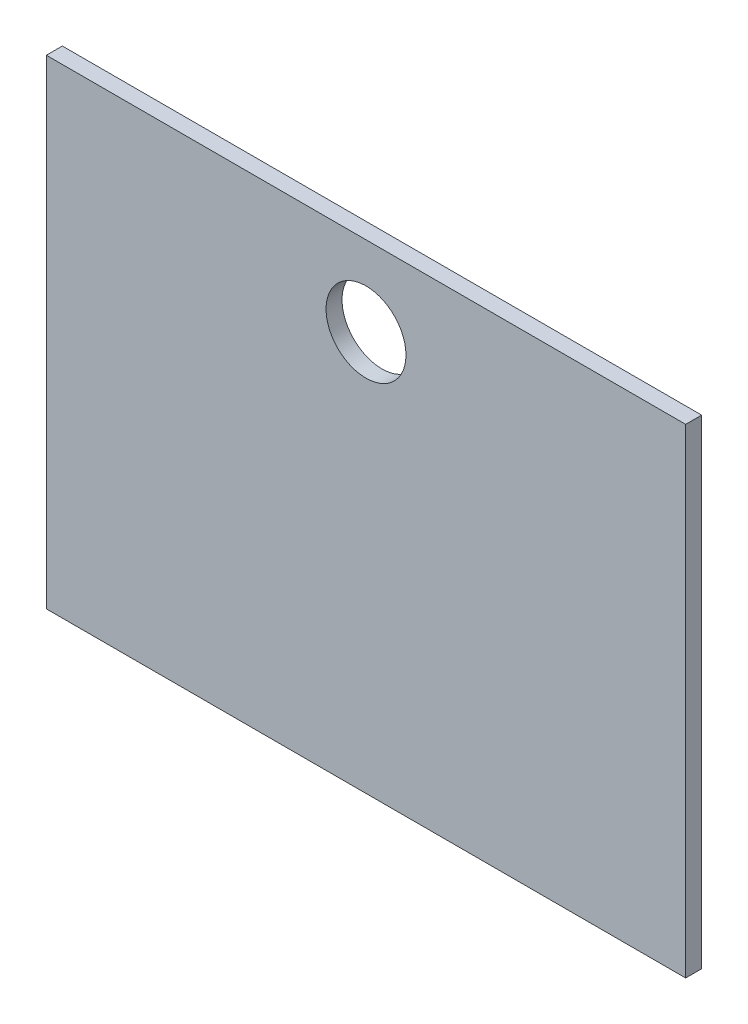
ISO-10303-21;
HEADER;
FILE_DESCRIPTION(('STEP AP214'),'2;1');
FILE_NAME('part.step','',(''),(''),'','','');
FILE_SCHEMA(('AUTOMOTIVE_DESIGN { 1 0 10303 214 1 1 1 1 }'));
ENDSEC;
DATA;
#1=APPLICATION_CONTEXT('core data for automotive mechanical design processes');
#2=APPLICATION_PROTOCOL_DEFINITION('international standard','automotive_design',2000,#1);
#3=PRODUCT_CONTEXT('',#1,'mechanical');
#4=PRODUCT('Part','Part','',(#3));
#5=PRODUCT_RELATED_PRODUCT_CATEGORY('part','',(#4));
#6=PRODUCT_DEFINITION_FORMATION('','',#4);
#7=PRODUCT_DEFINITION_CONTEXT('part definition',#1,'design');
#8=PRODUCT_DEFINITION('design','',#6,#7);
#9=PRODUCT_DEFINITION_SHAPE('','',#8);
#10=(LENGTH_UNIT() NAMED_UNIT(*) SI_UNIT(.MILLI.,.METRE.));
#11=(NAMED_UNIT(*) PLANE_ANGLE_UNIT() SI_UNIT($,.RADIAN.));
#12=(NAMED_UNIT(*) SI_UNIT($,.STERADIAN.) SOLID_ANGLE_UNIT());
#13=UNCERTAINTY_MEASURE_WITH_UNIT(LENGTH_MEASURE(1.E-05),#10,'distance_accuracy_value','');
#14=(GEOMETRIC_REPRESENTATION_CONTEXT(3) GLOBAL_UNCERTAINTY_ASSIGNED_CONTEXT((#13)) GLOBAL_UNIT_ASSIGNED_CONTEXT((#10,
#11,#12)) REPRESENTATION_CONTEXT('',''));
#15=CARTESIAN_POINT('',(0.,0.,0.));
#16=DIRECTION('',(0.,0.,1.));
#17=DIRECTION('',(1.,0.,0.));
#18=AXIS2_PLACEMENT_3D('',#15,#16,#17);
#19=CARTESIAN_POINT('',(-40.,9.99999999999999,2.));
#20=DIRECTION('',(1.,0.,0.));
#21=DIRECTION('',(0.,1.,0.));
#22=AXIS2_PLACEMENT_3D('',#19,#20,#21);
#23=PLANE('',#22);
#24=DIRECTION('',(0.,-1.,0.));
#25=VECTOR('',#24,1.);
#26=CARTESIAN_POINT('',(-40.,9.99999999999999,0.));
#27=LINE('',#26,#25);
#28=CARTESIAN_POINT('',(-40.,9.99999999999999,0.));
#29=VERTEX_POINT('',#28);
#30=CARTESIAN_POINT('',(-40.,-50.,0.));
#31=VERTEX_POINT('',#30);
#32=EDGE_CURVE('E86',#29,#31,#27,.T.);
#33=ORIENTED_EDGE('',*,*,#32,.T.);
#34=DIRECTION('',(0.,0.,-1.));
#35=VECTOR('',#34,1.);
#36=CARTESIAN_POINT('',(-40.,-50.,2.));
#37=LINE('',#36,#35);
#38=CARTESIAN_POINT('',(-40.,-50.,2.));
#39=VERTEX_POINT('',#38);
#40=EDGE_CURVE('E89',#39,#31,#37,.T.);
#41=ORIENTED_EDGE('',*,*,#40,.F.);
#42=DIRECTION('',(0.,-1.,0.));
#43=VECTOR('',#42,1.);
#44=CARTESIAN_POINT('',(-40.,9.99999999999999,2.));
#45=LINE('',#44,#43);
#46=CARTESIAN_POINT('',(-40.,9.99999999999999,2.));
#47=VERTEX_POINT('',#46);
#48=EDGE_CURVE('E73',#47,#39,#45,.T.);
#49=ORIENTED_EDGE('',*,*,#48,.F.);
#50=DIRECTION('',(0.,0.,-1.));
#51=VECTOR('',#50,1.);
#52=CARTESIAN_POINT('',(-40.,9.99999999999999,2.));
#53=LINE('',#52,#51);
#54=EDGE_CURVE('E49',#47,#29,#53,.T.);
#55=ORIENTED_EDGE('',*,*,#54,.T.);
#56=EDGE_LOOP('',(#33,#41,#49,#55));
#57=FACE_BOUND('',#56,.T.);
#58=ADVANCED_FACE('F41',(#57),#23,.F.);
#59=CARTESIAN_POINT('',(40.,10.,2.));
#60=DIRECTION('',(-1.,0.,0.));
#61=DIRECTION('',(0.,-1.,0.));
#62=AXIS2_PLACEMENT_3D('',#59,#60,#61);
#63=PLANE('',#62);
#64=DIRECTION('',(0.,1.,0.));
#65=VECTOR('',#64,1.);
#66=CARTESIAN_POINT('',(40.,10.,0.));
#67=LINE('',#66,#65);
#68=CARTESIAN_POINT('',(40.,-50.,0.));
#69=VERTEX_POINT('',#68);
#70=CARTESIAN_POINT('',(40.,10.,0.));
#71=VERTEX_POINT('',#70);
#72=EDGE_CURVE('E68',#69,#71,#67,.T.);
#73=ORIENTED_EDGE('',*,*,#72,.T.);
#74=DIRECTION('',(0.,0.,-1.));
#75=VECTOR('',#74,1.);
#76=CARTESIAN_POINT('',(40.,10.,2.));
#77=LINE('',#76,#75);
#78=CARTESIAN_POINT('',(40.,10.,2.));
#79=VERTEX_POINT('',#78);
#80=EDGE_CURVE('E11',#79,#71,#77,.T.);
#81=ORIENTED_EDGE('',*,*,#80,.F.);
#82=DIRECTION('',(0.,1.,0.));
#83=VECTOR('',#82,1.);
#84=CARTESIAN_POINT('',(40.,10.,2.));
#85=LINE('',#84,#83);
#86=CARTESIAN_POINT('',(40.,-50.,2.));
#87=VERTEX_POINT('',#86);
#88=EDGE_CURVE('E113',#87,#79,#85,.T.);
#89=ORIENTED_EDGE('',*,*,#88,.F.);
#90=DIRECTION('',(0.,0.,1.));
#91=VECTOR('',#90,1.);
#92=CARTESIAN_POINT('',(40.,-50.,2.));
#93=LINE('',#92,#91);
#94=EDGE_CURVE('E99',#69,#87,#93,.T.);
#95=ORIENTED_EDGE('',*,*,#94,.F.);
#96=EDGE_LOOP('',(#73,#81,#89,#95));
#97=FACE_BOUND('',#96,.T.);
#98=ADVANCED_FACE('F120',(#97),#63,.F.);
#99=CARTESIAN_POINT('',(40.,10.,2.));
#100=DIRECTION('',(0.,-1.,0.));
#101=DIRECTION('',(1.,0.,0.));
#102=AXIS2_PLACEMENT_3D('',#99,#100,#101);
#103=PLANE('',#102);
#104=DIRECTION('',(-1.,0.,0.));
#105=VECTOR('',#104,1.);
#106=CARTESIAN_POINT('',(40.,10.,0.));
#107=LINE('',#106,#105);
#108=EDGE_CURVE('E114',#71,#29,#107,.T.);
#109=ORIENTED_EDGE('',*,*,#108,.T.);
#110=ORIENTED_EDGE('',*,*,#54,.F.);
#111=DIRECTION('',(-1.,0.,0.));
#112=VECTOR('',#111,1.);
#113=CARTESIAN_POINT('',(40.,10.,2.));
#114=LINE('',#113,#112);
#115=EDGE_CURVE('E57',#79,#47,#114,.T.);
#116=ORIENTED_EDGE('',*,*,#115,.F.);
#117=ORIENTED_EDGE('',*,*,#80,.T.);
#118=EDGE_LOOP('',(#109,#110,#116,#117));
#119=FACE_BOUND('',#118,.T.);
#120=ADVANCED_FACE('F119',(#119),#103,.F.);
#121=CARTESIAN_POINT('',(0.,0.,2.));
#122=DIRECTION('',(0.,0.,-1.));
#123=DIRECTION('',(-1.,0.,0.));
#124=AXIS2_PLACEMENT_3D('',#121,#122,#123);
#125=PLANE('',#124);
#126=CARTESIAN_POINT('',(0.,0.,2.));
#127=DIRECTION('',(0.,0.,1.));
#128=DIRECTION('',(1.,0.,0.));
#129=AXIS2_PLACEMENT_3D('',#126,#127,#128);
#130=CIRCLE('',#129,5.);
#131=CARTESIAN_POINT('',(5.,0.,2.));
#132=VERTEX_POINT('',#131);
#133=EDGE_CURVE('E107',#132,#132,#130,.T.);
#134=ORIENTED_EDGE('',*,*,#133,.F.);
#135=EDGE_LOOP('',(#134));
#136=FACE_BOUND('',#135,.T.);
#137=ORIENTED_EDGE('',*,*,#48,.T.);
#138=DIRECTION('',(-1.,0.,0.));
#139=VECTOR('',#138,1.);
#140=CARTESIAN_POINT('',(-40.,-50.,2.));
#141=LINE('',#140,#139);
#142=EDGE_CURVE('E102',#87,#39,#141,.T.);
#143=ORIENTED_EDGE('',*,*,#142,.F.);
#144=ORIENTED_EDGE('',*,*,#88,.T.);
#145=ORIENTED_EDGE('',*,*,#115,.T.);
#146=EDGE_LOOP('',(#137,#143,#144,#145));
#147=FACE_BOUND('',#146,.T.);
#148=ADVANCED_FACE('F121',(#136,#147),#125,.F.);
#149=CARTESIAN_POINT('',(0.,0.,0.));
#150=DIRECTION('',(0.,0.,-1.));
#151=DIRECTION('',(-1.,0.,0.));
#152=AXIS2_PLACEMENT_3D('',#149,#150,#151);
#153=PLANE('',#152);
#154=CARTESIAN_POINT('',(0.,0.,0.));
#155=DIRECTION('',(0.,0.,1.));
#156=DIRECTION('',(1.,0.,0.));
#157=AXIS2_PLACEMENT_3D('',#154,#155,#156);
#158=CIRCLE('',#157,5.);
#159=CARTESIAN_POINT('',(5.,0.,0.));
#160=VERTEX_POINT('',#159);
#161=EDGE_CURVE('E92',#160,#160,#158,.T.);
#162=ORIENTED_EDGE('',*,*,#161,.T.);
#163=EDGE_LOOP('',(#162));
#164=FACE_BOUND('',#163,.T.);
#165=ORIENTED_EDGE('',*,*,#32,.F.);
#166=ORIENTED_EDGE('',*,*,#108,.F.);
#167=ORIENTED_EDGE('',*,*,#72,.F.);
#168=DIRECTION('',(1.,0.,0.));
#169=VECTOR('',#168,1.);
#170=CARTESIAN_POINT('',(-40.,-50.,0.));
#171=LINE('',#170,#169);
#172=EDGE_CURVE('E95',#31,#69,#171,.T.);
#173=ORIENTED_EDGE('',*,*,#172,.F.);
#174=EDGE_LOOP('',(#165,#166,#167,#173));
#175=FACE_BOUND('',#174,.T.);
#176=ADVANCED_FACE('F96',(#164,#175),#153,.T.);
#177=CARTESIAN_POINT('',(0.,0.,0.));
#178=DIRECTION('',(0.,0.,1.));
#179=DIRECTION('',(1.,0.,0.));
#180=AXIS2_PLACEMENT_3D('',#177,#178,#179);
#181=CYLINDRICAL_SURFACE('',#180,5.);
#182=ORIENTED_EDGE('',*,*,#161,.F.);
#183=EDGE_LOOP('',(#182));
#184=FACE_BOUND('',#183,.T.);
#185=ORIENTED_EDGE('',*,*,#133,.T.);
#186=EDGE_LOOP('',(#185));
#187=FACE_BOUND('',#186,.T.);
#188=ADVANCED_FACE('F129',(#184,#187),#181,.F.);
#189=CARTESIAN_POINT('',(0.,-50.,0.));
#190=DIRECTION('',(0.,-1.,0.));
#191=DIRECTION('',(1.,0.,0.));
#192=AXIS2_PLACEMENT_3D('',#189,#190,#191);
#193=PLANE('',#192);
#194=ORIENTED_EDGE('',*,*,#40,.T.);
#195=ORIENTED_EDGE('',*,*,#172,.T.);
#196=ORIENTED_EDGE('',*,*,#94,.T.);
#197=ORIENTED_EDGE('',*,*,#142,.T.);
#198=EDGE_LOOP('',(#194,#195,#196,#197));
#199=FACE_BOUND('',#198,.T.);
#200=ADVANCED_FACE('F101',(#199),#193,.T.);
#201=CLOSED_SHELL('',(#58,#98,#120,#148,#176,#188,#200));
#202=MANIFOLD_SOLID_BREP('B2',#201);
#203=ADVANCED_BREP_SHAPE_REPRESENTATION('',(#18,#202),#14);
#204=SHAPE_DEFINITION_REPRESENTATION(#9,#203);
ENDSEC;
END-ISO-10303-21;
